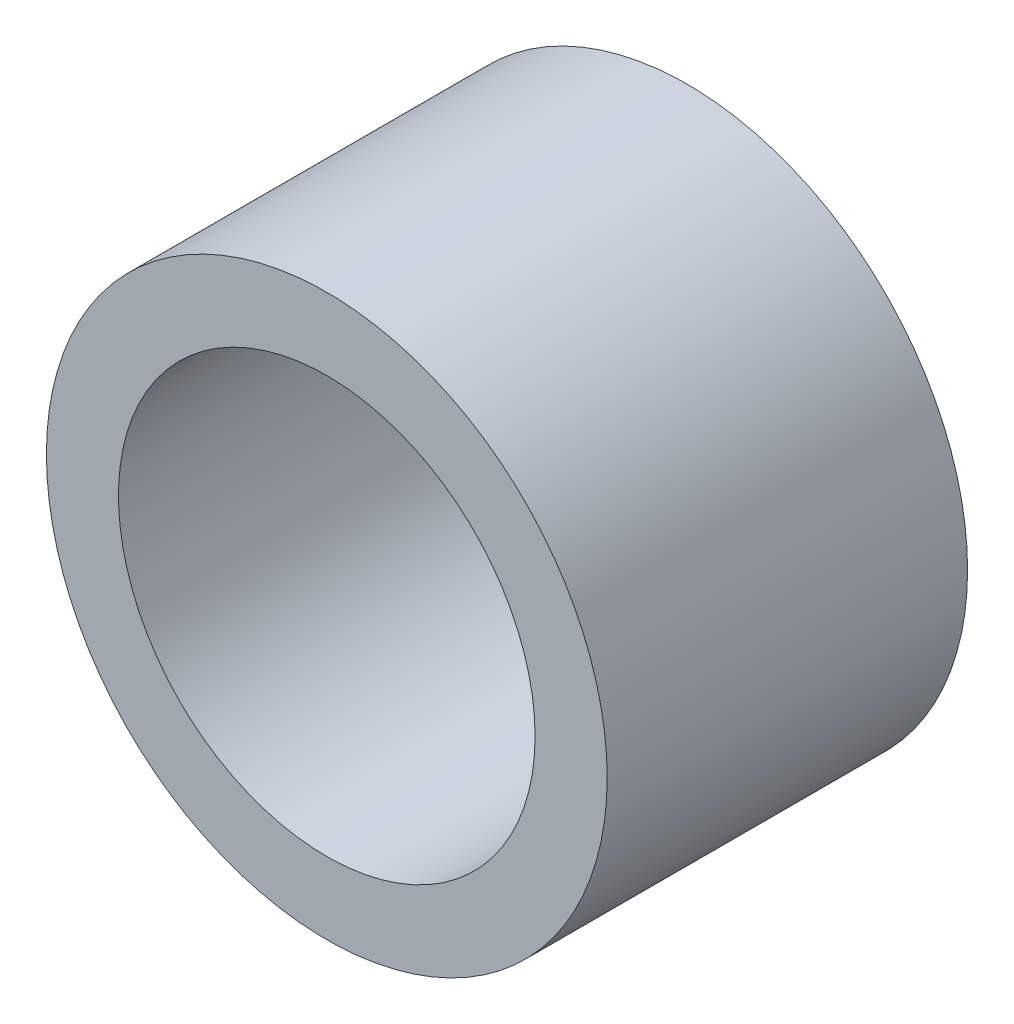
ISO-10303-21;
HEADER;
FILE_DESCRIPTION(('STEP AP214'),'2;1');
FILE_NAME('part.step','',(''),(''),'','','');
FILE_SCHEMA(('AUTOMOTIVE_DESIGN { 1 0 10303 214 1 1 1 1 }'));
ENDSEC;
DATA;
#1=APPLICATION_CONTEXT('core data for automotive mechanical design processes');
#2=APPLICATION_PROTOCOL_DEFINITION('international standard','automotive_design',2000,#1);
#3=PRODUCT_CONTEXT('',#1,'mechanical');
#4=PRODUCT('Part','Part','',(#3));
#5=PRODUCT_RELATED_PRODUCT_CATEGORY('part','',(#4));
#6=PRODUCT_DEFINITION_FORMATION('','',#4);
#7=PRODUCT_DEFINITION_CONTEXT('part definition',#1,'design');
#8=PRODUCT_DEFINITION('design','',#6,#7);
#9=PRODUCT_DEFINITION_SHAPE('','',#8);
#10=(LENGTH_UNIT() NAMED_UNIT(*) SI_UNIT(.MILLI.,.METRE.));
#11=(NAMED_UNIT(*) PLANE_ANGLE_UNIT() SI_UNIT($,.RADIAN.));
#12=(NAMED_UNIT(*) SI_UNIT($,.STERADIAN.) SOLID_ANGLE_UNIT());
#13=UNCERTAINTY_MEASURE_WITH_UNIT(LENGTH_MEASURE(1.E-05),#10,'distance_accuracy_value','');
#14=(GEOMETRIC_REPRESENTATION_CONTEXT(3) GLOBAL_UNCERTAINTY_ASSIGNED_CONTEXT((#13)) GLOBAL_UNIT_ASSIGNED_CONTEXT((#10,
#11,#12)) REPRESENTATION_CONTEXT('',''));
#15=CARTESIAN_POINT('',(0.,0.,0.));
#16=DIRECTION('',(0.,0.,1.));
#17=DIRECTION('',(1.,0.,0.));
#18=AXIS2_PLACEMENT_3D('',#15,#16,#17);
#19=CARTESIAN_POINT('',(0.,0.,5.));
#20=DIRECTION('',(0.,0.,1.));
#21=DIRECTION('',(1.,0.,0.));
#22=AXIS2_PLACEMENT_3D('',#19,#20,#21);
#23=PLANE('',#22);
#24=CARTESIAN_POINT('',(0.,0.,5.));
#25=DIRECTION('',(0.,0.,1.));
#26=DIRECTION('',(1.,0.,0.));
#27=AXIS2_PLACEMENT_3D('',#24,#25,#26);
#28=CIRCLE('',#27,3.89);
#29=CARTESIAN_POINT('',(3.89,0.,5.));
#30=VERTEX_POINT('',#29);
#31=EDGE_CURVE('E10',#30,#30,#28,.T.);
#32=ORIENTED_EDGE('',*,*,#31,.T.);
#33=EDGE_LOOP('',(#32));
#34=FACE_BOUND('',#33,.T.);
#35=CARTESIAN_POINT('',(0.,0.,5.));
#36=DIRECTION('',(0.,0.,1.));
#37=DIRECTION('',(1.,0.,0.));
#38=AXIS2_PLACEMENT_3D('',#35,#36,#37);
#39=CIRCLE('',#38,2.89);
#40=CARTESIAN_POINT('',(2.89,0.,5.));
#41=VERTEX_POINT('',#40);
#42=EDGE_CURVE('E50',#41,#41,#39,.T.);
#43=ORIENTED_EDGE('',*,*,#42,.F.);
#44=EDGE_LOOP('',(#43));
#45=FACE_BOUND('',#44,.T.);
#46=ADVANCED_FACE('F37',(#34,#45),#23,.T.);
#47=CARTESIAN_POINT('',(0.,0.,0.));
#48=DIRECTION('',(0.,0.,1.));
#49=DIRECTION('',(1.,0.,0.));
#50=AXIS2_PLACEMENT_3D('',#47,#48,#49);
#51=PLANE('',#50);
#52=CARTESIAN_POINT('',(0.,0.,0.));
#53=DIRECTION('',(0.,0.,1.));
#54=DIRECTION('',(1.,0.,0.));
#55=AXIS2_PLACEMENT_3D('',#52,#53,#54);
#56=CIRCLE('',#55,3.89);
#57=CARTESIAN_POINT('',(3.89,0.,0.));
#58=VERTEX_POINT('',#57);
#59=EDGE_CURVE('E41',#58,#58,#56,.T.);
#60=ORIENTED_EDGE('',*,*,#59,.F.);
#61=EDGE_LOOP('',(#60));
#62=FACE_BOUND('',#61,.T.);
#63=CARTESIAN_POINT('',(0.,0.,0.));
#64=DIRECTION('',(0.,0.,1.));
#65=DIRECTION('',(1.,0.,0.));
#66=AXIS2_PLACEMENT_3D('',#63,#64,#65);
#67=CIRCLE('',#66,2.89);
#68=CARTESIAN_POINT('',(2.89,0.,0.));
#69=VERTEX_POINT('',#68);
#70=EDGE_CURVE('E52',#69,#69,#67,.T.);
#71=ORIENTED_EDGE('',*,*,#70,.T.);
#72=EDGE_LOOP('',(#71));
#73=FACE_BOUND('',#72,.T.);
#74=ADVANCED_FACE('F64',(#62,#73),#51,.F.);
#75=CARTESIAN_POINT('',(0.,0.,5.));
#76=DIRECTION('',(0.,0.,-1.));
#77=DIRECTION('',(-1.,0.,0.));
#78=AXIS2_PLACEMENT_3D('',#75,#76,#77);
#79=CYLINDRICAL_SURFACE('',#78,3.89);
#80=ORIENTED_EDGE('',*,*,#31,.F.);
#81=EDGE_LOOP('',(#80));
#82=FACE_BOUND('',#81,.T.);
#83=ORIENTED_EDGE('',*,*,#59,.T.);
#84=EDGE_LOOP('',(#83));
#85=FACE_BOUND('',#84,.T.);
#86=ADVANCED_FACE('F39',(#82,#85),#79,.T.);
#87=CARTESIAN_POINT('',(0.,0.,5.));
#88=DIRECTION('',(0.,0.,-1.));
#89=DIRECTION('',(-1.,0.,0.));
#90=AXIS2_PLACEMENT_3D('',#87,#88,#89);
#91=CYLINDRICAL_SURFACE('',#90,2.89);
#92=ORIENTED_EDGE('',*,*,#42,.T.);
#93=EDGE_LOOP('',(#92));
#94=FACE_BOUND('',#93,.T.);
#95=ORIENTED_EDGE('',*,*,#70,.F.);
#96=EDGE_LOOP('',(#95));
#97=FACE_BOUND('',#96,.T.);
#98=ADVANCED_FACE('F60',(#94,#97),#91,.F.);
#99=CLOSED_SHELL('',(#46,#74,#86,#98));
#100=MANIFOLD_SOLID_BREP('B2',#99);
#101=ADVANCED_BREP_SHAPE_REPRESENTATION('',(#18,#100),#14);
#102=SHAPE_DEFINITION_REPRESENTATION(#9,#101);
ENDSEC;
END-ISO-10303-21;
